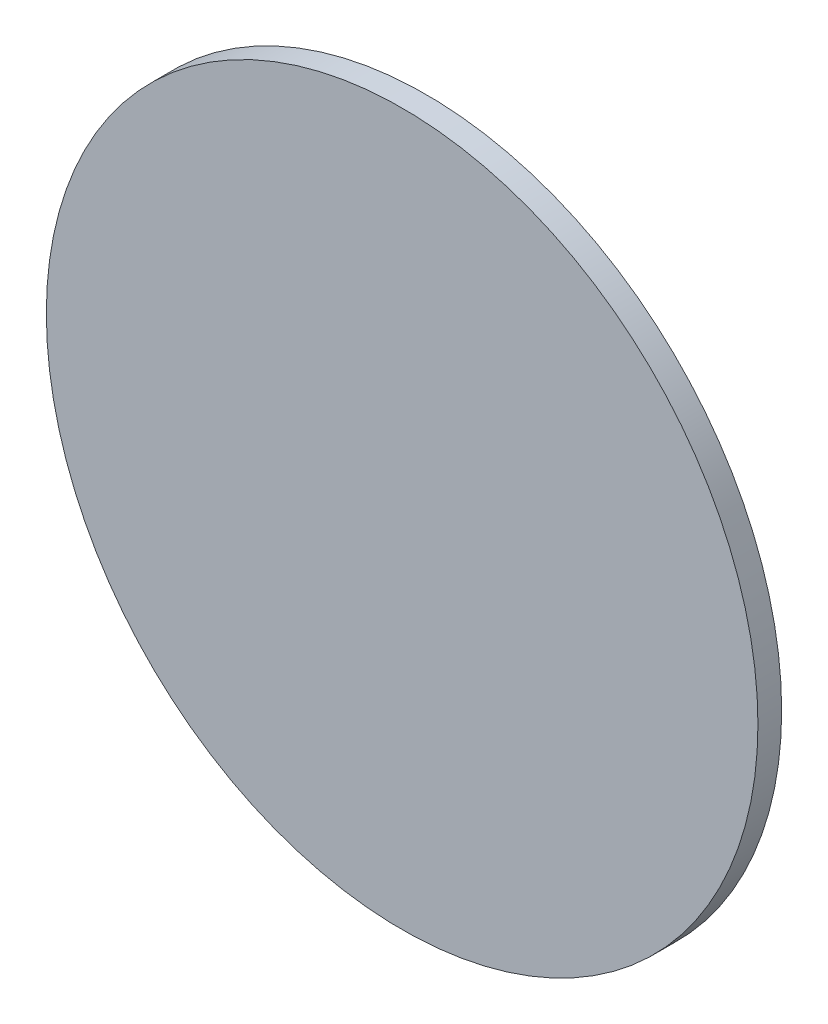
ISO-10303-21;
HEADER;
FILE_DESCRIPTION(('STEP AP214'),'2;1');
FILE_NAME('part.step','',(''),(''),'','','');
FILE_SCHEMA(('AUTOMOTIVE_DESIGN { 1 0 10303 214 1 1 1 1 }'));
ENDSEC;
DATA;
#1=APPLICATION_CONTEXT('core data for automotive mechanical design processes');
#2=APPLICATION_PROTOCOL_DEFINITION('international standard','automotive_design',2000,#1);
#3=PRODUCT_CONTEXT('',#1,'mechanical');
#4=PRODUCT('Part','Part','',(#3));
#5=PRODUCT_RELATED_PRODUCT_CATEGORY('part','',(#4));
#6=PRODUCT_DEFINITION_FORMATION('','',#4);
#7=PRODUCT_DEFINITION_CONTEXT('part definition',#1,'design');
#8=PRODUCT_DEFINITION('design','',#6,#7);
#9=PRODUCT_DEFINITION_SHAPE('','',#8);
#10=(LENGTH_UNIT() NAMED_UNIT(*) SI_UNIT(.MILLI.,.METRE.));
#11=(NAMED_UNIT(*) PLANE_ANGLE_UNIT() SI_UNIT($,.RADIAN.));
#12=(NAMED_UNIT(*) SI_UNIT($,.STERADIAN.) SOLID_ANGLE_UNIT());
#13=UNCERTAINTY_MEASURE_WITH_UNIT(LENGTH_MEASURE(1.E-05),#10,'distance_accuracy_value','');
#14=(GEOMETRIC_REPRESENTATION_CONTEXT(3) GLOBAL_UNCERTAINTY_ASSIGNED_CONTEXT((#13)) GLOBAL_UNIT_ASSIGNED_CONTEXT((#10,
#11,#12)) REPRESENTATION_CONTEXT('',''));
#15=CARTESIAN_POINT('',(0.,0.,0.));
#16=DIRECTION('',(0.,0.,1.));
#17=DIRECTION('',(1.,0.,0.));
#18=AXIS2_PLACEMENT_3D('',#15,#16,#17);
#19=CARTESIAN_POINT('',(0.,0.,4.));
#20=DIRECTION('',(0.,0.,-1.));
#21=DIRECTION('',(-1.,0.,0.));
#22=AXIS2_PLACEMENT_3D('',#19,#20,#21);
#23=CYLINDRICAL_SURFACE('',#22,60.);
#24=CARTESIAN_POINT('',(0.,0.,4.));
#25=DIRECTION('',(0.,0.,1.));
#26=DIRECTION('',(1.,0.,0.));
#27=AXIS2_PLACEMENT_3D('',#24,#25,#26);
#28=CIRCLE('',#27,60.);
#29=CARTESIAN_POINT('',(60.,0.,4.));
#30=VERTEX_POINT('',#29);
#31=EDGE_CURVE('E10',#30,#30,#28,.T.);
#32=ORIENTED_EDGE('',*,*,#31,.F.);
#33=EDGE_LOOP('',(#32));
#34=FACE_BOUND('',#33,.T.);
#35=CARTESIAN_POINT('',(0.,0.,0.));
#36=DIRECTION('',(0.,0.,1.));
#37=DIRECTION('',(1.,0.,0.));
#38=AXIS2_PLACEMENT_3D('',#35,#36,#37);
#39=CIRCLE('',#38,60.);
#40=CARTESIAN_POINT('',(60.,0.,0.));
#41=VERTEX_POINT('',#40);
#42=EDGE_CURVE('E47',#41,#41,#39,.T.);
#43=ORIENTED_EDGE('',*,*,#42,.T.);
#44=EDGE_LOOP('',(#43));
#45=FACE_BOUND('',#44,.T.);
#46=ADVANCED_FACE('F44',(#34,#45),#23,.T.);
#47=CARTESIAN_POINT('',(0.,0.,4.));
#48=DIRECTION('',(0.,0.,1.));
#49=DIRECTION('',(1.,0.,0.));
#50=AXIS2_PLACEMENT_3D('',#47,#48,#49);
#51=PLANE('',#50);
#52=ORIENTED_EDGE('',*,*,#31,.T.);
#53=EDGE_LOOP('',(#52));
#54=FACE_BOUND('',#53,.T.);
#55=ADVANCED_FACE('F155',(#54),#51,.T.);
#56=CARTESIAN_POINT('',(0.,0.,0.));
#57=DIRECTION('',(0.,0.,1.));
#58=DIRECTION('',(1.,0.,0.));
#59=AXIS2_PLACEMENT_3D('',#56,#57,#58);
#60=PLANE('',#59);
#61=ORIENTED_EDGE('',*,*,#42,.F.);
#62=EDGE_LOOP('',(#61));
#63=FACE_BOUND('',#62,.T.);
#64=ADVANCED_FACE('F157',(#63),#60,.F.);
#65=CLOSED_SHELL('',(#46,#55,#64));
#66=CARTESIAN_POINT('',(0.,20.,3.1));
#67=DIRECTION('',(0.,0.,-1.));
#68=DIRECTION('',(-1.,0.,0.));
#69=AXIS2_PLACEMENT_3D('',#66,#67,#68);
#70=CYLINDRICAL_SURFACE('',#69,2.7);
#71=CARTESIAN_POINT('',(0.,20.,3.1));
#72=DIRECTION('',(0.,0.,-1.));
#73=DIRECTION('',(-1.,0.,0.));
#74=AXIS2_PLACEMENT_3D('',#71,#72,#73);
#75=CIRCLE('',#74,2.7);
#76=CARTESIAN_POINT('',(-2.7,20.,3.1));
#77=VERTEX_POINT('',#76);
#78=EDGE_CURVE('E58',#77,#77,#75,.T.);
#79=ORIENTED_EDGE('',*,*,#78,.F.);
#80=EDGE_LOOP('',(#79));
#81=FACE_BOUND('',#80,.T.);
#82=CARTESIAN_POINT('',(0.,20.,0.6));
#83=DIRECTION('',(0.,0.,-1.));
#84=DIRECTION('',(-1.,0.,0.));
#85=AXIS2_PLACEMENT_3D('',#82,#83,#84);
#86=CIRCLE('',#85,2.7);
#87=CARTESIAN_POINT('',(-2.7,20.,0.6));
#88=VERTEX_POINT('',#87);
#89=EDGE_CURVE('E83',#88,#88,#86,.T.);
#90=ORIENTED_EDGE('',*,*,#89,.T.);
#91=EDGE_LOOP('',(#90));
#92=FACE_BOUND('',#91,.T.);
#93=ADVANCED_FACE('F92',(#81,#92),#70,.F.);
#94=CARTESIAN_POINT('',(0.,20.,3.1));
#95=DIRECTION('',(0.,0.,-1.));
#96=DIRECTION('',(-1.,0.,0.));
#97=AXIS2_PLACEMENT_3D('',#94,#95,#96);
#98=PLANE('',#97);
#99=ORIENTED_EDGE('',*,*,#78,.T.);
#100=EDGE_LOOP('',(#99));
#101=FACE_BOUND('',#100,.T.);
#102=ADVANCED_FACE('F90',(#101),#98,.T.);
#103=CARTESIAN_POINT('',(0.,20.,0.6));
#104=DIRECTION('',(0.,0.,-1.));
#105=DIRECTION('',(-1.,0.,0.));
#106=AXIS2_PLACEMENT_3D('',#103,#104,#105);
#107=PLANE('',#106);
#108=ORIENTED_EDGE('',*,*,#89,.F.);
#109=EDGE_LOOP('',(#108));
#110=FACE_BOUND('',#109,.T.);
#111=ADVANCED_FACE('F99',(#110),#107,.F.);
#112=CLOSED_SHELL('',(#93,#102,#111));
#113=CARTESIAN_POINT('',(-20.,0.,3.1));
#114=DIRECTION('',(0.,0.,-1.));
#115=DIRECTION('',(-1.,0.,0.));
#116=AXIS2_PLACEMENT_3D('',#113,#114,#115);
#117=CYLINDRICAL_SURFACE('',#116,2.7);
#118=CARTESIAN_POINT('',(-20.,0.,3.1));
#119=DIRECTION('',(0.,0.,-1.));
#120=DIRECTION('',(-1.,0.,0.));
#121=AXIS2_PLACEMENT_3D('',#118,#119,#120);
#122=CIRCLE('',#121,2.7);
#123=CARTESIAN_POINT('',(-22.7,0.,3.1));
#124=VERTEX_POINT('',#123);
#125=EDGE_CURVE('E79',#124,#124,#122,.T.);
#126=ORIENTED_EDGE('',*,*,#125,.F.);
#127=EDGE_LOOP('',(#126));
#128=FACE_BOUND('',#127,.T.);
#129=CARTESIAN_POINT('',(-20.,0.,0.6));
#130=DIRECTION('',(0.,0.,-1.));
#131=DIRECTION('',(-1.,0.,0.));
#132=AXIS2_PLACEMENT_3D('',#129,#130,#131);
#133=CIRCLE('',#132,2.7);
#134=CARTESIAN_POINT('',(-22.7,0.,0.6));
#135=VERTEX_POINT('',#134);
#136=EDGE_CURVE('E76',#135,#135,#133,.T.);
#137=ORIENTED_EDGE('',*,*,#136,.T.);
#138=EDGE_LOOP('',(#137));
#139=FACE_BOUND('',#138,.T.);
#140=ADVANCED_FACE('F115',(#128,#139),#117,.F.);
#141=CARTESIAN_POINT('',(-20.,0.,3.1));
#142=DIRECTION('',(0.,0.,-1.));
#143=DIRECTION('',(-1.,0.,0.));
#144=AXIS2_PLACEMENT_3D('',#141,#142,#143);
#145=PLANE('',#144);
#146=ORIENTED_EDGE('',*,*,#125,.T.);
#147=EDGE_LOOP('',(#146));
#148=FACE_BOUND('',#147,.T.);
#149=ADVANCED_FACE('F116',(#148),#145,.T.);
#150=CARTESIAN_POINT('',(-20.,0.,0.6));
#151=DIRECTION('',(0.,0.,-1.));
#152=DIRECTION('',(-1.,0.,0.));
#153=AXIS2_PLACEMENT_3D('',#150,#151,#152);
#154=PLANE('',#153);
#155=ORIENTED_EDGE('',*,*,#136,.F.);
#156=EDGE_LOOP('',(#155));
#157=FACE_BOUND('',#156,.T.);
#158=ADVANCED_FACE('F122',(#157),#154,.F.);
#159=CLOSED_SHELL('',(#140,#149,#158));
#160=CARTESIAN_POINT('',(0.,-20.,3.1));
#161=DIRECTION('',(0.,0.,-1.));
#162=DIRECTION('',(-1.,0.,0.));
#163=AXIS2_PLACEMENT_3D('',#160,#161,#162);
#164=CYLINDRICAL_SURFACE('',#163,2.7);
#165=CARTESIAN_POINT('',(0.,-20.,3.1));
#166=DIRECTION('',(0.,0.,-1.));
#167=DIRECTION('',(-1.,0.,0.));
#168=AXIS2_PLACEMENT_3D('',#165,#166,#167);
#169=CIRCLE('',#168,2.7);
#170=CARTESIAN_POINT('',(-2.7,-20.,3.1));
#171=VERTEX_POINT('',#170);
#172=EDGE_CURVE('E72',#171,#171,#169,.T.);
#173=ORIENTED_EDGE('',*,*,#172,.F.);
#174=EDGE_LOOP('',(#173));
#175=FACE_BOUND('',#174,.T.);
#176=CARTESIAN_POINT('',(0.,-20.,0.6));
#177=DIRECTION('',(0.,0.,-1.));
#178=DIRECTION('',(-1.,0.,0.));
#179=AXIS2_PLACEMENT_3D('',#176,#177,#178);
#180=CIRCLE('',#179,2.7);
#181=CARTESIAN_POINT('',(-2.7,-20.,0.6));
#182=VERTEX_POINT('',#181);
#183=EDGE_CURVE('E68',#182,#182,#180,.T.);
#184=ORIENTED_EDGE('',*,*,#183,.T.);
#185=EDGE_LOOP('',(#184));
#186=FACE_BOUND('',#185,.T.);
#187=ADVANCED_FACE('F134',(#175,#186),#164,.F.);
#188=CARTESIAN_POINT('',(0.,-20.,3.1));
#189=DIRECTION('',(0.,0.,-1.));
#190=DIRECTION('',(-1.,0.,0.));
#191=AXIS2_PLACEMENT_3D('',#188,#189,#190);
#192=PLANE('',#191);
#193=ORIENTED_EDGE('',*,*,#172,.T.);
#194=EDGE_LOOP('',(#193));
#195=FACE_BOUND('',#194,.T.);
#196=ADVANCED_FACE('F130',(#195),#192,.T.);
#197=CARTESIAN_POINT('',(0.,-20.,0.6));
#198=DIRECTION('',(0.,0.,-1.));
#199=DIRECTION('',(-1.,0.,0.));
#200=AXIS2_PLACEMENT_3D('',#197,#198,#199);
#201=PLANE('',#200);
#202=ORIENTED_EDGE('',*,*,#183,.F.);
#203=EDGE_LOOP('',(#202));
#204=FACE_BOUND('',#203,.T.);
#205=ADVANCED_FACE('F133',(#204),#201,.F.);
#206=CLOSED_SHELL('',(#187,#196,#205));
#207=CARTESIAN_POINT('',(20.,0.,3.1));
#208=DIRECTION('',(0.,0.,-1.));
#209=DIRECTION('',(-1.,0.,0.));
#210=AXIS2_PLACEMENT_3D('',#207,#208,#209);
#211=CYLINDRICAL_SURFACE('',#210,2.7);
#212=CARTESIAN_POINT('',(20.,0.,3.1));
#213=DIRECTION('',(0.,0.,-1.));
#214=DIRECTION('',(-1.,0.,0.));
#215=AXIS2_PLACEMENT_3D('',#212,#213,#214);
#216=CIRCLE('',#215,2.7);
#217=CARTESIAN_POINT('',(17.3,0.,3.1));
#218=VERTEX_POINT('',#217);
#219=EDGE_CURVE('E64',#218,#218,#216,.T.);
#220=ORIENTED_EDGE('',*,*,#219,.F.);
#221=EDGE_LOOP('',(#220));
#222=FACE_BOUND('',#221,.T.);
#223=CARTESIAN_POINT('',(20.,0.,0.6));
#224=DIRECTION('',(0.,0.,-1.));
#225=DIRECTION('',(-1.,0.,0.));
#226=AXIS2_PLACEMENT_3D('',#223,#224,#225);
#227=CIRCLE('',#226,2.7);
#228=CARTESIAN_POINT('',(17.3,0.,0.6));
#229=VERTEX_POINT('',#228);
#230=EDGE_CURVE('E60',#229,#229,#227,.T.);
#231=ORIENTED_EDGE('',*,*,#230,.T.);
#232=EDGE_LOOP('',(#231));
#233=FACE_BOUND('',#232,.T.);
#234=ADVANCED_FACE('F146',(#222,#233),#211,.F.);
#235=CARTESIAN_POINT('',(20.,0.,3.1));
#236=DIRECTION('',(0.,0.,-1.));
#237=DIRECTION('',(-1.,0.,0.));
#238=AXIS2_PLACEMENT_3D('',#235,#236,#237);
#239=PLANE('',#238);
#240=ORIENTED_EDGE('',*,*,#219,.T.);
#241=EDGE_LOOP('',(#240));
#242=FACE_BOUND('',#241,.T.);
#243=ADVANCED_FACE('F142',(#242),#239,.T.);
#244=CARTESIAN_POINT('',(20.,0.,0.6));
#245=DIRECTION('',(0.,0.,-1.));
#246=DIRECTION('',(-1.,0.,0.));
#247=AXIS2_PLACEMENT_3D('',#244,#245,#246);
#248=PLANE('',#247);
#249=ORIENTED_EDGE('',*,*,#230,.F.);
#250=EDGE_LOOP('',(#249));
#251=FACE_BOUND('',#250,.T.);
#252=ADVANCED_FACE('F145',(#251),#248,.F.);
#253=CLOSED_SHELL('',(#234,#243,#252));
#254=ORIENTED_CLOSED_SHELL('',*,#112,.T.);
#255=ORIENTED_CLOSED_SHELL('',*,#159,.T.);
#256=ORIENTED_CLOSED_SHELL('',*,#206,.T.);
#257=ORIENTED_CLOSED_SHELL('',*,#253,.T.);
#258=BREP_WITH_VOIDS('B2',#65,(#254,#255,#256,#257));
#259=ADVANCED_BREP_SHAPE_REPRESENTATION('',(#18,#258),#14);
#260=SHAPE_DEFINITION_REPRESENTATION(#9,#259);
ENDSEC;
END-ISO-10303-21;
